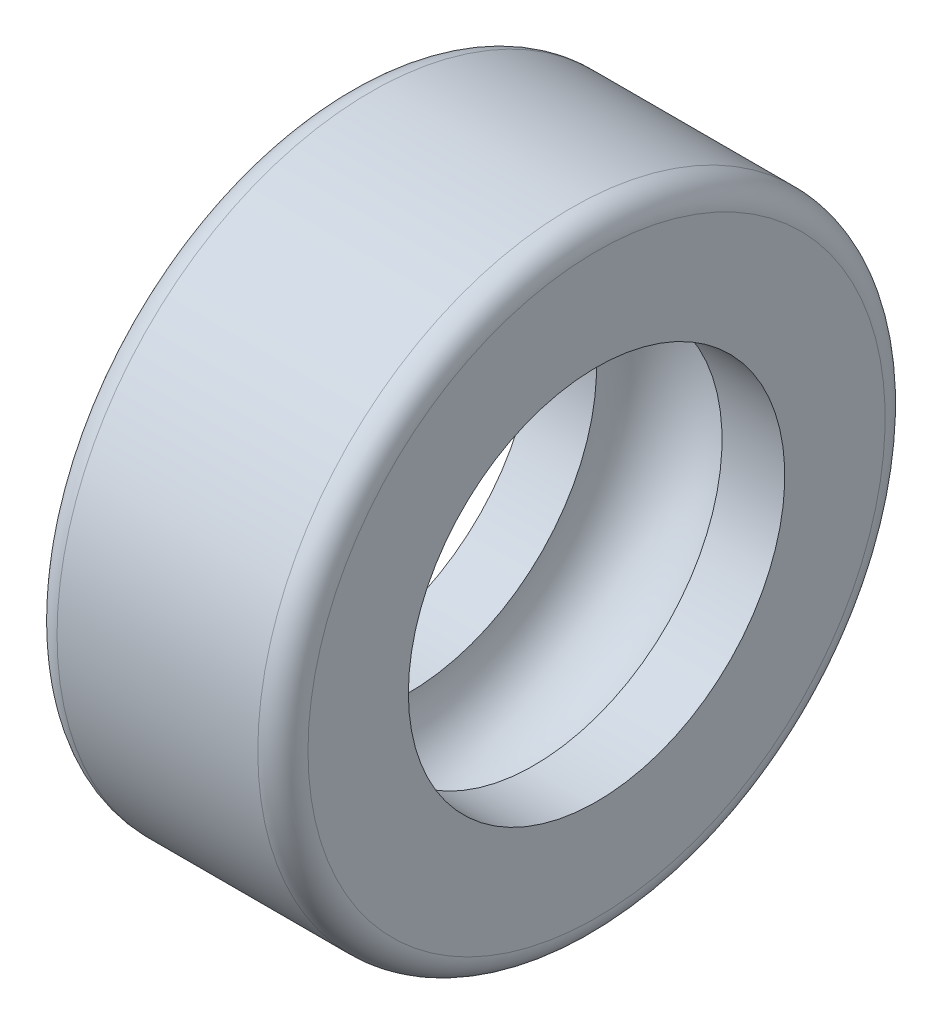
ISO-10303-21;
HEADER;
FILE_DESCRIPTION(('STEP AP214'),'2;1');
FILE_NAME('part.step','',(''),(''),'','','');
FILE_SCHEMA(('AUTOMOTIVE_DESIGN { 1 0 10303 214 1 1 1 1 }'));
ENDSEC;
DATA;
#1=APPLICATION_CONTEXT('core data for automotive mechanical design processes');
#2=APPLICATION_PROTOCOL_DEFINITION('international standard','automotive_design',2000,#1);
#3=PRODUCT_CONTEXT('',#1,'mechanical');
#4=PRODUCT('Part','Part','',(#3));
#5=PRODUCT_RELATED_PRODUCT_CATEGORY('part','',(#4));
#6=PRODUCT_DEFINITION_FORMATION('','',#4);
#7=PRODUCT_DEFINITION_CONTEXT('part definition',#1,'design');
#8=PRODUCT_DEFINITION('design','',#6,#7);
#9=PRODUCT_DEFINITION_SHAPE('','',#8);
#10=(LENGTH_UNIT() NAMED_UNIT(*) SI_UNIT(.MILLI.,.METRE.));
#11=(NAMED_UNIT(*) PLANE_ANGLE_UNIT() SI_UNIT($,.RADIAN.));
#12=(NAMED_UNIT(*) SI_UNIT($,.STERADIAN.) SOLID_ANGLE_UNIT());
#13=UNCERTAINTY_MEASURE_WITH_UNIT(LENGTH_MEASURE(1.E-05),#10,'distance_accuracy_value','');
#14=(GEOMETRIC_REPRESENTATION_CONTEXT(3) GLOBAL_UNCERTAINTY_ASSIGNED_CONTEXT((#13)) GLOBAL_UNIT_ASSIGNED_CONTEXT((#10,
#11,#12)) REPRESENTATION_CONTEXT('',''));
#15=CARTESIAN_POINT('',(0.,0.,0.));
#16=DIRECTION('',(0.,0.,1.));
#17=DIRECTION('',(1.,0.,0.));
#18=AXIS2_PLACEMENT_3D('',#15,#16,#17);
#19=CARTESIAN_POINT('',(-5.,12.5,0.));
#20=DIRECTION('',(1.,0.,0.));
#21=DIRECTION('',(0.,0.,-1.));
#22=AXIS2_PLACEMENT_3D('',#19,#20,#21);
#23=PLANE('',#22);
#24=CARTESIAN_POINT('',(-5.,0.,0.));
#25=DIRECTION('',(1.,0.,0.));
#26=DIRECTION('',(0.,0.,-1.));
#27=AXIS2_PLACEMENT_3D('',#24,#25,#26);
#28=CIRCLE('',#27,11.5);
#29=CARTESIAN_POINT('',(-5.,0.,-11.5));
#30=VERTEX_POINT('',#29);
#31=EDGE_CURVE('E10',#30,#30,#28,.F.);
#32=ORIENTED_EDGE('',*,*,#31,.T.);
#33=EDGE_LOOP('',(#32));
#34=FACE_BOUND('',#33,.T.);
#35=CARTESIAN_POINT('',(-5.,0.,0.));
#36=DIRECTION('',(-1.,0.,0.));
#37=DIRECTION('',(0.,0.,1.));
#38=AXIS2_PLACEMENT_3D('',#35,#36,#37);
#39=CIRCLE('',#38,7.5);
#40=CARTESIAN_POINT('',(-5.,0.,7.5));
#41=VERTEX_POINT('',#40);
#42=EDGE_CURVE('E51',#41,#41,#39,.T.);
#43=ORIENTED_EDGE('',*,*,#42,.F.);
#44=EDGE_LOOP('',(#43));
#45=FACE_BOUND('',#44,.T.);
#46=ADVANCED_FACE('F31',(#34,#45),#23,.F.);
#47=CARTESIAN_POINT('',(0.,0.,0.));
#48=DIRECTION('',(-1.,0.,0.));
#49=DIRECTION('',(0.,0.,1.));
#50=AXIS2_PLACEMENT_3D('',#47,#48,#49);
#51=CYLINDRICAL_SURFACE('',#50,7.5);
#52=CARTESIAN_POINT('',(-2.5,0.,0.));
#53=DIRECTION('',(-1.,0.,0.));
#54=DIRECTION('',(0.,0.,1.));
#55=AXIS2_PLACEMENT_3D('',#52,#53,#54);
#56=CIRCLE('',#55,7.5);
#57=CARTESIAN_POINT('',(-2.5,0.,7.5));
#58=VERTEX_POINT('',#57);
#59=EDGE_CURVE('E54',#58,#58,#56,.T.);
#60=ORIENTED_EDGE('',*,*,#59,.F.);
#61=EDGE_LOOP('',(#60));
#62=FACE_BOUND('',#61,.T.);
#63=ORIENTED_EDGE('',*,*,#42,.T.);
#64=EDGE_LOOP('',(#63));
#65=FACE_BOUND('',#64,.T.);
#66=ADVANCED_FACE('F75',(#62,#65),#51,.F.);
#67=CARTESIAN_POINT('',(0.,0.,0.));
#68=DIRECTION('',(-1.,0.,0.));
#69=DIRECTION('',(0.,0.,1.));
#70=AXIS2_PLACEMENT_3D('',#67,#68,#69);
#71=TOROIDAL_SURFACE('',#70,7.5,2.5);
#72=CARTESIAN_POINT('',(2.5,0.,0.));
#73=DIRECTION('',(-1.,0.,0.));
#74=DIRECTION('',(0.,0.,1.));
#75=AXIS2_PLACEMENT_3D('',#72,#73,#74);
#76=CIRCLE('',#75,7.5);
#77=CARTESIAN_POINT('',(2.5,0.,7.5));
#78=VERTEX_POINT('',#77);
#79=EDGE_CURVE('E57',#78,#78,#76,.T.);
#80=ORIENTED_EDGE('',*,*,#79,.F.);
#81=EDGE_LOOP('',(#80));
#82=FACE_BOUND('',#81,.T.);
#83=ORIENTED_EDGE('',*,*,#59,.T.);
#84=EDGE_LOOP('',(#83));
#85=FACE_BOUND('',#84,.T.);
#86=ADVANCED_FACE('F69',(#82,#85),#71,.F.);
#87=CARTESIAN_POINT('',(0.,0.,0.));
#88=DIRECTION('',(-1.,0.,0.));
#89=DIRECTION('',(0.,0.,1.));
#90=AXIS2_PLACEMENT_3D('',#87,#88,#89);
#91=CYLINDRICAL_SURFACE('',#90,7.5);
#92=CARTESIAN_POINT('',(5.,0.,0.));
#93=DIRECTION('',(-1.,0.,0.));
#94=DIRECTION('',(0.,0.,1.));
#95=AXIS2_PLACEMENT_3D('',#92,#93,#94);
#96=CIRCLE('',#95,7.5);
#97=CARTESIAN_POINT('',(5.,0.,7.5));
#98=VERTEX_POINT('',#97);
#99=EDGE_CURVE('E60',#98,#98,#96,.T.);
#100=ORIENTED_EDGE('',*,*,#99,.F.);
#101=EDGE_LOOP('',(#100));
#102=FACE_BOUND('',#101,.T.);
#103=ORIENTED_EDGE('',*,*,#79,.T.);
#104=EDGE_LOOP('',(#103));
#105=FACE_BOUND('',#104,.T.);
#106=ADVANCED_FACE('F66',(#102,#105),#91,.F.);
#107=CARTESIAN_POINT('',(5.,12.5,0.));
#108=DIRECTION('',(-1.,0.,0.));
#109=DIRECTION('',(0.,0.,1.));
#110=AXIS2_PLACEMENT_3D('',#107,#108,#109);
#111=PLANE('',#110);
#112=CARTESIAN_POINT('',(5.,0.,0.));
#113=DIRECTION('',(-1.,0.,0.));
#114=DIRECTION('',(0.,0.,1.));
#115=AXIS2_PLACEMENT_3D('',#112,#113,#114);
#116=CIRCLE('',#115,11.5);
#117=CARTESIAN_POINT('',(5.,0.,11.5));
#118=VERTEX_POINT('',#117);
#119=EDGE_CURVE('E38',#118,#118,#116,.F.);
#120=ORIENTED_EDGE('',*,*,#119,.T.);
#121=EDGE_LOOP('',(#120));
#122=FACE_BOUND('',#121,.T.);
#123=ORIENTED_EDGE('',*,*,#99,.T.);
#124=EDGE_LOOP('',(#123));
#125=FACE_BOUND('',#124,.T.);
#126=ADVANCED_FACE('F64',(#122,#125),#111,.F.);
#127=CARTESIAN_POINT('',(0.,0.,0.));
#128=DIRECTION('',(-1.,0.,0.));
#129=DIRECTION('',(0.,0.,1.));
#130=AXIS2_PLACEMENT_3D('',#127,#128,#129);
#131=CYLINDRICAL_SURFACE('',#130,12.5);
#132=CARTESIAN_POINT('',(4.,0.,0.));
#133=DIRECTION('',(-1.,0.,0.));
#134=DIRECTION('',(0.,0.,1.));
#135=AXIS2_PLACEMENT_3D('',#132,#133,#134);
#136=CIRCLE('',#135,12.5);
#137=CARTESIAN_POINT('',(4.,0.,12.5));
#138=VERTEX_POINT('',#137);
#139=EDGE_CURVE('E42',#138,#138,#136,.T.);
#140=ORIENTED_EDGE('',*,*,#139,.T.);
#141=EDGE_LOOP('',(#140));
#142=FACE_BOUND('',#141,.T.);
#143=CARTESIAN_POINT('',(-4.,0.,0.));
#144=DIRECTION('',(1.,0.,0.));
#145=DIRECTION('',(0.,0.,-1.));
#146=AXIS2_PLACEMENT_3D('',#143,#144,#145);
#147=CIRCLE('',#146,12.5);
#148=CARTESIAN_POINT('',(-4.,0.,-12.5));
#149=VERTEX_POINT('',#148);
#150=EDGE_CURVE('E46',#149,#149,#147,.T.);
#151=ORIENTED_EDGE('',*,*,#150,.T.);
#152=EDGE_LOOP('',(#151));
#153=FACE_BOUND('',#152,.T.);
#154=ADVANCED_FACE('F90',(#142,#153),#131,.T.);
#155=CARTESIAN_POINT('',(4.,0.,0.));
#156=DIRECTION('',(-1.,0.,0.));
#157=DIRECTION('',(0.,0.,1.));
#158=AXIS2_PLACEMENT_3D('',#155,#156,#157);
#159=TOROIDAL_SURFACE('',#158,11.5,1.);
#160=ORIENTED_EDGE('',*,*,#119,.F.);
#161=EDGE_LOOP('',(#160));
#162=FACE_BOUND('',#161,.T.);
#163=ORIENTED_EDGE('',*,*,#139,.F.);
#164=EDGE_LOOP('',(#163));
#165=FACE_BOUND('',#164,.T.);
#166=ADVANCED_FACE('F88',(#162,#165),#159,.T.);
#167=CARTESIAN_POINT('',(-4.,0.,0.));
#168=DIRECTION('',(1.,0.,0.));
#169=DIRECTION('',(0.,0.,-1.));
#170=AXIS2_PLACEMENT_3D('',#167,#168,#169);
#171=TOROIDAL_SURFACE('',#170,11.5,1.);
#172=ORIENTED_EDGE('',*,*,#150,.F.);
#173=EDGE_LOOP('',(#172));
#174=FACE_BOUND('',#173,.T.);
#175=ORIENTED_EDGE('',*,*,#31,.F.);
#176=EDGE_LOOP('',(#175));
#177=FACE_BOUND('',#176,.T.);
#178=ADVANCED_FACE('F33',(#174,#177),#171,.T.);
#179=CLOSED_SHELL('',(#46,#66,#86,#106,#126,#154,#166,#178));
#180=MANIFOLD_SOLID_BREP('B2',#179);
#181=ADVANCED_BREP_SHAPE_REPRESENTATION('',(#18,#180),#14);
#182=SHAPE_DEFINITION_REPRESENTATION(#9,#181);
ENDSEC;
END-ISO-10303-21;
